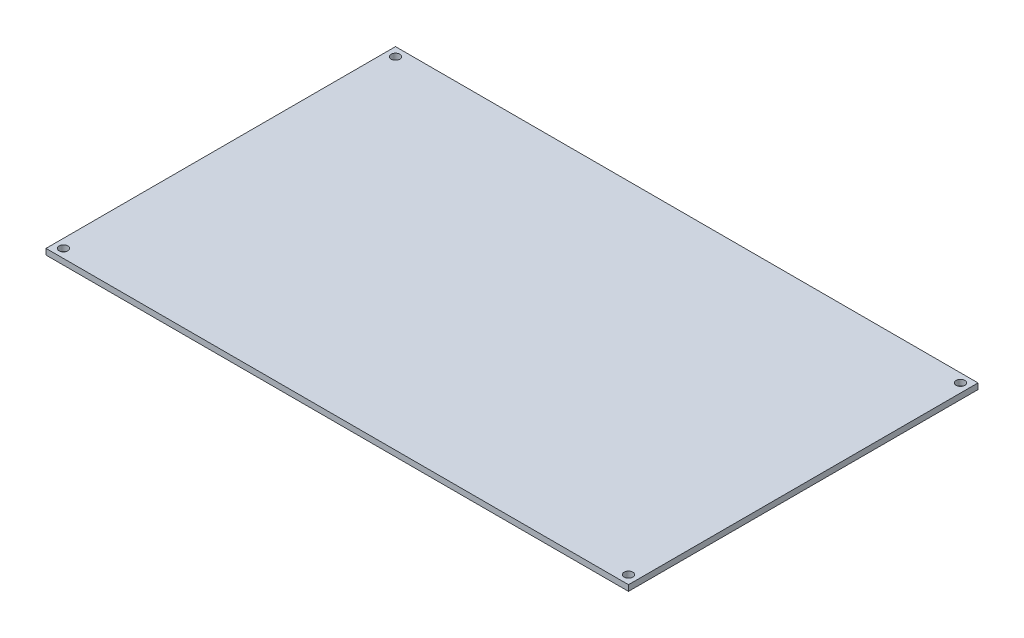
ISO-10303-21;
HEADER;
FILE_DESCRIPTION(('STEP AP214'),'2;1');
FILE_NAME('part.step','',(''),(''),'','','');
FILE_SCHEMA(('AUTOMOTIVE_DESIGN { 1 0 10303 214 1 1 1 1 }'));
ENDSEC;
DATA;
#1=APPLICATION_CONTEXT('core data for automotive mechanical design processes');
#2=APPLICATION_PROTOCOL_DEFINITION('international standard','automotive_design',2000,#1);
#3=PRODUCT_CONTEXT('',#1,'mechanical');
#4=PRODUCT('Part','Part','',(#3));
#5=PRODUCT_RELATED_PRODUCT_CATEGORY('part','',(#4));
#6=PRODUCT_DEFINITION_FORMATION('','',#4);
#7=PRODUCT_DEFINITION_CONTEXT('part definition',#1,'design');
#8=PRODUCT_DEFINITION('design','',#6,#7);
#9=PRODUCT_DEFINITION_SHAPE('','',#8);
#10=(LENGTH_UNIT() NAMED_UNIT(*) SI_UNIT(.MILLI.,.METRE.));
#11=(NAMED_UNIT(*) PLANE_ANGLE_UNIT() SI_UNIT($,.RADIAN.));
#12=(NAMED_UNIT(*) SI_UNIT($,.STERADIAN.) SOLID_ANGLE_UNIT());
#13=UNCERTAINTY_MEASURE_WITH_UNIT(LENGTH_MEASURE(1.E-05),#10,'distance_accuracy_value','');
#14=(GEOMETRIC_REPRESENTATION_CONTEXT(3) GLOBAL_UNCERTAINTY_ASSIGNED_CONTEXT((#13)) GLOBAL_UNIT_ASSIGNED_CONTEXT((#10,
#11,#12)) REPRESENTATION_CONTEXT('',''));
#15=CARTESIAN_POINT('',(0.,0.,0.));
#16=DIRECTION('',(0.,0.,1.));
#17=DIRECTION('',(1.,0.,0.));
#18=AXIS2_PLACEMENT_3D('',#15,#16,#17);
#19=CARTESIAN_POINT('',(0.,2.,0.));
#20=DIRECTION('',(1.,0.,0.));
#21=DIRECTION('',(0.,0.,-1.));
#22=AXIS2_PLACEMENT_3D('',#19,#20,#21);
#23=PLANE('',#22);
#24=DIRECTION('',(0.,0.,1.));
#25=VECTOR('',#24,1.);
#26=CARTESIAN_POINT('',(0.,0.,0.));
#27=LINE('',#26,#25);
#28=CARTESIAN_POINT('',(0.,0.,-120.));
#29=VERTEX_POINT('',#28);
#30=CARTESIAN_POINT('',(0.,0.,0.));
#31=VERTEX_POINT('',#30);
#32=EDGE_CURVE('E99',#29,#31,#27,.T.);
#33=ORIENTED_EDGE('',*,*,#32,.T.);
#34=DIRECTION('',(0.,-1.,0.));
#35=VECTOR('',#34,1.);
#36=CARTESIAN_POINT('',(0.,2.,0.));
#37=LINE('',#36,#35);
#38=CARTESIAN_POINT('',(0.,2.,0.));
#39=VERTEX_POINT('',#38);
#40=EDGE_CURVE('E11',#39,#31,#37,.T.);
#41=ORIENTED_EDGE('',*,*,#40,.F.);
#42=DIRECTION('',(0.,0.,1.));
#43=VECTOR('',#42,1.);
#44=CARTESIAN_POINT('',(0.,2.,0.));
#45=LINE('',#44,#43);
#46=CARTESIAN_POINT('',(0.,2.,-120.));
#47=VERTEX_POINT('',#46);
#48=EDGE_CURVE('E86',#47,#39,#45,.T.);
#49=ORIENTED_EDGE('',*,*,#48,.F.);
#50=DIRECTION('',(0.,-1.,0.));
#51=VECTOR('',#50,1.);
#52=CARTESIAN_POINT('',(0.,2.,-120.));
#53=LINE('',#52,#51);
#54=EDGE_CURVE('E95',#47,#29,#53,.T.);
#55=ORIENTED_EDGE('',*,*,#54,.T.);
#56=EDGE_LOOP('',(#33,#41,#49,#55));
#57=FACE_BOUND('',#56,.T.);
#58=ADVANCED_FACE('F33',(#57),#23,.F.);
#59=CARTESIAN_POINT('',(0.,2.,0.));
#60=DIRECTION('',(0.,0.,-1.));
#61=DIRECTION('',(-1.,0.,0.));
#62=AXIS2_PLACEMENT_3D('',#59,#60,#61);
#63=PLANE('',#62);
#64=DIRECTION('',(1.,0.,0.));
#65=VECTOR('',#64,1.);
#66=CARTESIAN_POINT('',(0.,0.,0.));
#67=LINE('',#66,#65);
#68=CARTESIAN_POINT('',(200.,0.,0.));
#69=VERTEX_POINT('',#68);
#70=EDGE_CURVE('E90',#31,#69,#67,.T.);
#71=ORIENTED_EDGE('',*,*,#70,.T.);
#72=DIRECTION('',(0.,-1.,0.));
#73=VECTOR('',#72,1.);
#74=CARTESIAN_POINT('',(200.,2.,0.));
#75=LINE('',#74,#73);
#76=CARTESIAN_POINT('',(200.,2.,0.));
#77=VERTEX_POINT('',#76);
#78=EDGE_CURVE('E42',#77,#69,#75,.T.);
#79=ORIENTED_EDGE('',*,*,#78,.F.);
#80=DIRECTION('',(1.,0.,0.));
#81=VECTOR('',#80,1.);
#82=CARTESIAN_POINT('',(0.,2.,0.));
#83=LINE('',#82,#81);
#84=EDGE_CURVE('E81',#39,#77,#83,.T.);
#85=ORIENTED_EDGE('',*,*,#84,.F.);
#86=ORIENTED_EDGE('',*,*,#40,.T.);
#87=EDGE_LOOP('',(#71,#79,#85,#86));
#88=FACE_BOUND('',#87,.T.);
#89=ADVANCED_FACE('F89',(#88),#63,.F.);
#90=CARTESIAN_POINT('',(200.,2.,0.));
#91=DIRECTION('',(-1.,0.,0.));
#92=DIRECTION('',(0.,0.,1.));
#93=AXIS2_PLACEMENT_3D('',#90,#91,#92);
#94=PLANE('',#93);
#95=DIRECTION('',(0.,0.,-1.));
#96=VECTOR('',#95,1.);
#97=CARTESIAN_POINT('',(200.,0.,0.));
#98=LINE('',#97,#96);
#99=CARTESIAN_POINT('',(200.,0.,-120.));
#100=VERTEX_POINT('',#99);
#101=EDGE_CURVE('E68',#69,#100,#98,.T.);
#102=ORIENTED_EDGE('',*,*,#101,.T.);
#103=DIRECTION('',(0.,-1.,0.));
#104=VECTOR('',#103,1.);
#105=CARTESIAN_POINT('',(200.,2.,-120.));
#106=LINE('',#105,#104);
#107=CARTESIAN_POINT('',(200.,2.,-120.));
#108=VERTEX_POINT('',#107);
#109=EDGE_CURVE('E91',#108,#100,#106,.T.);
#110=ORIENTED_EDGE('',*,*,#109,.F.);
#111=DIRECTION('',(0.,0.,-1.));
#112=VECTOR('',#111,1.);
#113=CARTESIAN_POINT('',(200.,2.,0.));
#114=LINE('',#113,#112);
#115=EDGE_CURVE('E84',#77,#108,#114,.T.);
#116=ORIENTED_EDGE('',*,*,#115,.F.);
#117=ORIENTED_EDGE('',*,*,#78,.T.);
#118=EDGE_LOOP('',(#102,#110,#116,#117));
#119=FACE_BOUND('',#118,.T.);
#120=ADVANCED_FACE('F93',(#119),#94,.F.);
#121=CARTESIAN_POINT('',(0.,2.,-120.));
#122=DIRECTION('',(0.,0.,1.));
#123=DIRECTION('',(1.,0.,0.));
#124=AXIS2_PLACEMENT_3D('',#121,#122,#123);
#125=PLANE('',#124);
#126=DIRECTION('',(-1.,0.,0.));
#127=VECTOR('',#126,1.);
#128=CARTESIAN_POINT('',(0.,0.,-120.));
#129=LINE('',#128,#127);
#130=EDGE_CURVE('E74',#100,#29,#129,.T.);
#131=ORIENTED_EDGE('',*,*,#130,.T.);
#132=ORIENTED_EDGE('',*,*,#54,.F.);
#133=DIRECTION('',(-1.,0.,0.));
#134=VECTOR('',#133,1.);
#135=CARTESIAN_POINT('',(0.,2.,-120.));
#136=LINE('',#135,#134);
#137=EDGE_CURVE('E51',#108,#47,#136,.T.);
#138=ORIENTED_EDGE('',*,*,#137,.F.);
#139=ORIENTED_EDGE('',*,*,#109,.T.);
#140=EDGE_LOOP('',(#131,#132,#138,#139));
#141=FACE_BOUND('',#140,.T.);
#142=ADVANCED_FACE('F140',(#141),#125,.F.);
#143=CARTESIAN_POINT('',(0.,2.,0.));
#144=DIRECTION('',(0.,-1.,0.));
#145=DIRECTION('',(0.,0.,-1.));
#146=AXIS2_PLACEMENT_3D('',#143,#144,#145);
#147=PLANE('',#146);
#148=CARTESIAN_POINT('',(197.,2.,-3.));
#149=DIRECTION('',(0.,1.,0.));
#150=DIRECTION('',(0.,0.,1.));
#151=AXIS2_PLACEMENT_3D('',#148,#149,#150);
#152=CIRCLE('',#151,1.5);
#153=CARTESIAN_POINT('',(197.,2.,-1.5));
#154=VERTEX_POINT('',#153);
#155=EDGE_CURVE('E114',#154,#154,#152,.T.);
#156=ORIENTED_EDGE('',*,*,#155,.F.);
#157=EDGE_LOOP('',(#156));
#158=FACE_BOUND('',#157,.T.);
#159=CARTESIAN_POINT('',(3.,2.,-3.));
#160=DIRECTION('',(0.,1.,0.));
#161=DIRECTION('',(0.,0.,1.));
#162=AXIS2_PLACEMENT_3D('',#159,#160,#161);
#163=CIRCLE('',#162,1.5);
#164=CARTESIAN_POINT('',(3.,2.,-1.5));
#165=VERTEX_POINT('',#164);
#166=EDGE_CURVE('E129',#165,#165,#163,.T.);
#167=ORIENTED_EDGE('',*,*,#166,.F.);
#168=EDGE_LOOP('',(#167));
#169=FACE_BOUND('',#168,.T.);
#170=CARTESIAN_POINT('',(3.,2.,-117.));
#171=DIRECTION('',(0.,1.,0.));
#172=DIRECTION('',(0.,0.,1.));
#173=AXIS2_PLACEMENT_3D('',#170,#171,#172);
#174=CIRCLE('',#173,1.5);
#175=CARTESIAN_POINT('',(3.,2.,-115.5));
#176=VERTEX_POINT('',#175);
#177=EDGE_CURVE('E126',#176,#176,#174,.T.);
#178=ORIENTED_EDGE('',*,*,#177,.F.);
#179=EDGE_LOOP('',(#178));
#180=FACE_BOUND('',#179,.T.);
#181=CARTESIAN_POINT('',(197.,2.,-117.));
#182=DIRECTION('',(0.,1.,0.));
#183=DIRECTION('',(0.,0.,1.));
#184=AXIS2_PLACEMENT_3D('',#181,#182,#183);
#185=CIRCLE('',#184,1.5);
#186=CARTESIAN_POINT('',(197.,2.,-115.5));
#187=VERTEX_POINT('',#186);
#188=EDGE_CURVE('E110',#187,#187,#185,.T.);
#189=ORIENTED_EDGE('',*,*,#188,.F.);
#190=EDGE_LOOP('',(#189));
#191=FACE_BOUND('',#190,.T.);
#192=ORIENTED_EDGE('',*,*,#48,.T.);
#193=ORIENTED_EDGE('',*,*,#84,.T.);
#194=ORIENTED_EDGE('',*,*,#115,.T.);
#195=ORIENTED_EDGE('',*,*,#137,.T.);
#196=EDGE_LOOP('',(#192,#193,#194,#195));
#197=FACE_BOUND('',#196,.T.);
#198=ADVANCED_FACE('F82',(#158,#169,#180,#191,#197),#147,.F.);
#199=CARTESIAN_POINT('',(0.,0.,0.));
#200=DIRECTION('',(0.,-1.,0.));
#201=DIRECTION('',(0.,0.,-1.));
#202=AXIS2_PLACEMENT_3D('',#199,#200,#201);
#203=PLANE('',#202);
#204=CARTESIAN_POINT('',(197.,0.,-3.));
#205=DIRECTION('',(0.,-1.,0.));
#206=DIRECTION('',(0.,0.,-1.));
#207=AXIS2_PLACEMENT_3D('',#204,#205,#206);
#208=CIRCLE('',#207,1.5);
#209=CARTESIAN_POINT('',(197.,0.,-4.5));
#210=VERTEX_POINT('',#209);
#211=EDGE_CURVE('E36',#210,#210,#208,.T.);
#212=ORIENTED_EDGE('',*,*,#211,.F.);
#213=EDGE_LOOP('',(#212));
#214=FACE_BOUND('',#213,.T.);
#215=CARTESIAN_POINT('',(3.,0.,-3.));
#216=DIRECTION('',(0.,-1.,0.));
#217=DIRECTION('',(0.,0.,-1.));
#218=AXIS2_PLACEMENT_3D('',#215,#216,#217);
#219=CIRCLE('',#218,1.5);
#220=CARTESIAN_POINT('',(3.,0.,-4.5));
#221=VERTEX_POINT('',#220);
#222=EDGE_CURVE('E113',#221,#221,#219,.T.);
#223=ORIENTED_EDGE('',*,*,#222,.F.);
#224=EDGE_LOOP('',(#223));
#225=FACE_BOUND('',#224,.T.);
#226=CARTESIAN_POINT('',(3.,0.,-117.));
#227=DIRECTION('',(0.,-1.,0.));
#228=DIRECTION('',(0.,0.,-1.));
#229=AXIS2_PLACEMENT_3D('',#226,#227,#228);
#230=CIRCLE('',#229,1.5);
#231=CARTESIAN_POINT('',(3.,0.,-118.5));
#232=VERTEX_POINT('',#231);
#233=EDGE_CURVE('E111',#232,#232,#230,.T.);
#234=ORIENTED_EDGE('',*,*,#233,.F.);
#235=EDGE_LOOP('',(#234));
#236=FACE_BOUND('',#235,.T.);
#237=CARTESIAN_POINT('',(197.,0.,-117.));
#238=DIRECTION('',(0.,-1.,0.));
#239=DIRECTION('',(0.,0.,-1.));
#240=AXIS2_PLACEMENT_3D('',#237,#238,#239);
#241=CIRCLE('',#240,1.5);
#242=CARTESIAN_POINT('',(197.,0.,-118.5));
#243=VERTEX_POINT('',#242);
#244=EDGE_CURVE('E102',#243,#243,#241,.T.);
#245=ORIENTED_EDGE('',*,*,#244,.F.);
#246=EDGE_LOOP('',(#245));
#247=FACE_BOUND('',#246,.T.);
#248=ORIENTED_EDGE('',*,*,#32,.F.);
#249=ORIENTED_EDGE('',*,*,#130,.F.);
#250=ORIENTED_EDGE('',*,*,#101,.F.);
#251=ORIENTED_EDGE('',*,*,#70,.F.);
#252=EDGE_LOOP('',(#248,#249,#250,#251));
#253=FACE_BOUND('',#252,.T.);
#254=ADVANCED_FACE('F139',(#214,#225,#236,#247,#253),#203,.T.);
#255=CARTESIAN_POINT('',(197.,-1.,-117.));
#256=DIRECTION('',(0.,1.,0.));
#257=DIRECTION('',(0.,0.,1.));
#258=AXIS2_PLACEMENT_3D('',#255,#256,#257);
#259=CYLINDRICAL_SURFACE('',#258,1.5);
#260=ORIENTED_EDGE('',*,*,#244,.T.);
#261=EDGE_LOOP('',(#260));
#262=FACE_BOUND('',#261,.T.);
#263=ORIENTED_EDGE('',*,*,#188,.T.);
#264=EDGE_LOOP('',(#263));
#265=FACE_BOUND('',#264,.T.);
#266=ADVANCED_FACE('F150',(#262,#265),#259,.F.);
#267=CARTESIAN_POINT('',(3.,-1.,-117.));
#268=DIRECTION('',(0.,1.,0.));
#269=DIRECTION('',(0.,0.,1.));
#270=AXIS2_PLACEMENT_3D('',#267,#268,#269);
#271=CYLINDRICAL_SURFACE('',#270,1.5);
#272=ORIENTED_EDGE('',*,*,#233,.T.);
#273=EDGE_LOOP('',(#272));
#274=FACE_BOUND('',#273,.T.);
#275=ORIENTED_EDGE('',*,*,#177,.T.);
#276=EDGE_LOOP('',(#275));
#277=FACE_BOUND('',#276,.T.);
#278=ADVANCED_FACE('F147',(#274,#277),#271,.F.);
#279=CARTESIAN_POINT('',(3.,-1.,-3.));
#280=DIRECTION('',(0.,1.,0.));
#281=DIRECTION('',(0.,0.,1.));
#282=AXIS2_PLACEMENT_3D('',#279,#280,#281);
#283=CYLINDRICAL_SURFACE('',#282,1.5);
#284=ORIENTED_EDGE('',*,*,#222,.T.);
#285=EDGE_LOOP('',(#284));
#286=FACE_BOUND('',#285,.T.);
#287=ORIENTED_EDGE('',*,*,#166,.T.);
#288=EDGE_LOOP('',(#287));
#289=FACE_BOUND('',#288,.T.);
#290=ADVANCED_FACE('F149',(#286,#289),#283,.F.);
#291=CARTESIAN_POINT('',(197.,-1.,-3.));
#292=DIRECTION('',(0.,1.,0.));
#293=DIRECTION('',(0.,0.,1.));
#294=AXIS2_PLACEMENT_3D('',#291,#292,#293);
#295=CYLINDRICAL_SURFACE('',#294,1.5);
#296=ORIENTED_EDGE('',*,*,#211,.T.);
#297=EDGE_LOOP('',(#296));
#298=FACE_BOUND('',#297,.T.);
#299=ORIENTED_EDGE('',*,*,#155,.T.);
#300=EDGE_LOOP('',(#299));
#301=FACE_BOUND('',#300,.T.);
#302=ADVANCED_FACE('F135',(#298,#301),#295,.F.);
#303=CLOSED_SHELL('',(#58,#89,#120,#142,#198,#254,#266,#278,#290,#302));
#304=MANIFOLD_SOLID_BREP('B2',#303);
#305=ADVANCED_BREP_SHAPE_REPRESENTATION('',(#18,#304),#14);
#306=SHAPE_DEFINITION_REPRESENTATION(#9,#305);
ENDSEC;
END-ISO-10303-21;
